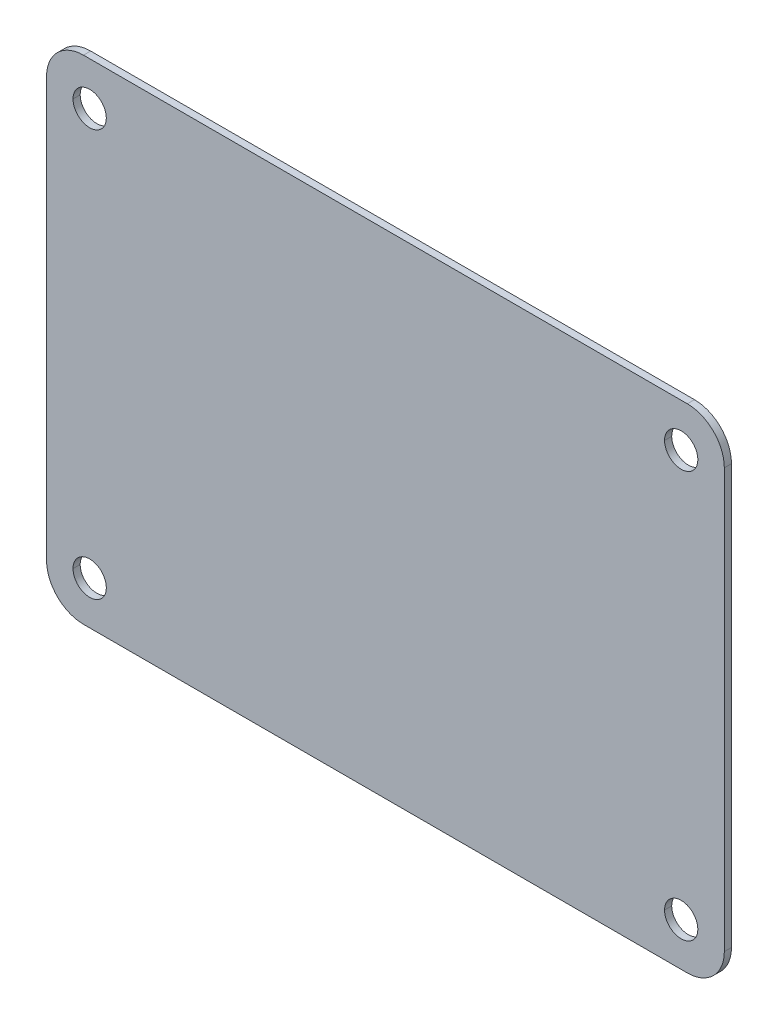
ISO-10303-21;
HEADER;
FILE_DESCRIPTION(('STEP AP214'),'2;1');
FILE_NAME('part.step','',(''),(''),'','','');
FILE_SCHEMA(('AUTOMOTIVE_DESIGN { 1 0 10303 214 1 1 1 1 }'));
ENDSEC;
DATA;
#1=APPLICATION_CONTEXT('core data for automotive mechanical design processes');
#2=APPLICATION_PROTOCOL_DEFINITION('international standard','automotive_design',2000,#1);
#3=PRODUCT_CONTEXT('',#1,'mechanical');
#4=PRODUCT('Part','Part','',(#3));
#5=PRODUCT_RELATED_PRODUCT_CATEGORY('part','',(#4));
#6=PRODUCT_DEFINITION_FORMATION('','',#4);
#7=PRODUCT_DEFINITION_CONTEXT('part definition',#1,'design');
#8=PRODUCT_DEFINITION('design','',#6,#7);
#9=PRODUCT_DEFINITION_SHAPE('','',#8);
#10=(LENGTH_UNIT() NAMED_UNIT(*) SI_UNIT(.MILLI.,.METRE.));
#11=(NAMED_UNIT(*) PLANE_ANGLE_UNIT() SI_UNIT($,.RADIAN.));
#12=(NAMED_UNIT(*) SI_UNIT($,.STERADIAN.) SOLID_ANGLE_UNIT());
#13=UNCERTAINTY_MEASURE_WITH_UNIT(LENGTH_MEASURE(1.E-05),#10,'distance_accuracy_value','');
#14=(GEOMETRIC_REPRESENTATION_CONTEXT(3) GLOBAL_UNCERTAINTY_ASSIGNED_CONTEXT((#13)) GLOBAL_UNIT_ASSIGNED_CONTEXT((#10,
#11,#12)) REPRESENTATION_CONTEXT('',''));
#15=CARTESIAN_POINT('',(0.,0.,0.));
#16=DIRECTION('',(0.,0.,1.));
#17=DIRECTION('',(1.,0.,0.));
#18=AXIS2_PLACEMENT_3D('',#15,#16,#17);
#19=CARTESIAN_POINT('',(27.499999555869,35.999999598533,0.8761000001));
#20=DIRECTION('',(0.,0.,1.));
#21=DIRECTION('',(1.,0.,0.));
#22=AXIS2_PLACEMENT_3D('',#19,#20,#21);
#23=PLANE('',#22);
#24=CARTESIAN_POINT('',(51.500000136726,52.499998525994,0.8761000001));
#25=DIRECTION('',(0.,0.,-1.));
#26=DIRECTION('',(1.,0.,0.));
#27=AXIS2_PLACEMENT_3D('',#24,#25,#26);
#28=CIRCLE('',#27,1.349999863275);
#29=CARTESIAN_POINT('',(52.850000000001,52.499998525994,0.8761000001));
#30=VERTEX_POINT('',#29);
#31=CARTESIAN_POINT('',(50.150000273451,52.499998525994,0.8761000001));
#32=VERTEX_POINT('',#31);
#33=EDGE_CURVE('E169',#30,#32,#28,.T.);
#34=ORIENTED_EDGE('',*,*,#33,.T.);
#35=CARTESIAN_POINT('',(51.500000136726,52.499998525994,0.8761000001));
#36=DIRECTION('',(0.,0.,-1.));
#37=DIRECTION('',(1.,0.,0.));
#38=AXIS2_PLACEMENT_3D('',#35,#36,#37);
#39=CIRCLE('',#38,1.349999863275);
#40=EDGE_CURVE('E11',#32,#30,#39,.T.);
#41=ORIENTED_EDGE('',*,*,#40,.T.);
#42=EDGE_LOOP('',(#34,#41));
#43=FACE_BOUND('',#42,.T.);
#44=CARTESIAN_POINT('',(3.500000092163,52.499999091341,0.8761000001));
#45=DIRECTION('',(0.,0.,-1.));
#46=DIRECTION('',(1.,0.,0.));
#47=AXIS2_PLACEMENT_3D('',#44,#45,#46);
#48=CIRCLE('',#47,1.349999907837);
#49=CARTESIAN_POINT('',(4.85,52.499999091341,0.8761000001));
#50=VERTEX_POINT('',#49);
#51=CARTESIAN_POINT('',(2.150000184326,52.499999091341,0.8761000001));
#52=VERTEX_POINT('',#51);
#53=EDGE_CURVE('E235',#50,#52,#48,.T.);
#54=ORIENTED_EDGE('',*,*,#53,.T.);
#55=CARTESIAN_POINT('',(3.500000092163,52.499999091341,0.8761000001));
#56=DIRECTION('',(0.,0.,-1.));
#57=DIRECTION('',(1.,0.,0.));
#58=AXIS2_PLACEMENT_3D('',#55,#56,#57);
#59=CIRCLE('',#58,1.349999907837);
#60=EDGE_CURVE('E28',#52,#50,#59,.T.);
#61=ORIENTED_EDGE('',*,*,#60,.T.);
#62=EDGE_LOOP('',(#54,#61));
#63=FACE_BOUND('',#62,.T.);
#64=CARTESIAN_POINT('',(51.500000136726,19.499998525994,0.8761000001));
#65=DIRECTION('',(0.,0.,-1.));
#66=DIRECTION('',(1.,0.,0.));
#67=AXIS2_PLACEMENT_3D('',#64,#65,#66);
#68=CIRCLE('',#67,1.349999863275);
#69=CARTESIAN_POINT('',(52.850000000001,19.499998525994,0.8761000001));
#70=VERTEX_POINT('',#69);
#71=CARTESIAN_POINT('',(50.150000273451,19.499998525994,0.8761000001));
#72=VERTEX_POINT('',#71);
#73=EDGE_CURVE('E247',#70,#72,#68,.T.);
#74=ORIENTED_EDGE('',*,*,#73,.T.);
#75=CARTESIAN_POINT('',(51.500000136726,19.499998525994,0.8761000001));
#76=DIRECTION('',(0.,0.,-1.));
#77=DIRECTION('',(1.,0.,0.));
#78=AXIS2_PLACEMENT_3D('',#75,#76,#77);
#79=CIRCLE('',#78,1.349999863275);
#80=EDGE_CURVE('E246',#72,#70,#79,.T.);
#81=ORIENTED_EDGE('',*,*,#80,.T.);
#82=EDGE_LOOP('',(#74,#81));
#83=FACE_BOUND('',#82,.T.);
#84=CARTESIAN_POINT('',(3.499999780028,19.496399991386,0.8761000001));
#85=DIRECTION('',(0.,0.,-1.));
#86=DIRECTION('',(1.,0.,0.));
#87=AXIS2_PLACEMENT_3D('',#84,#85,#86);
#88=CIRCLE('',#87,1.350000219972);
#89=CARTESIAN_POINT('',(4.85,19.496399991386,0.8761000001));
#90=VERTEX_POINT('',#89);
#91=CARTESIAN_POINT('',(2.149999560056,19.496399991386,0.8761000001));
#92=VERTEX_POINT('',#91);
#93=EDGE_CURVE('E188',#90,#92,#88,.T.);
#94=ORIENTED_EDGE('',*,*,#93,.T.);
#95=CARTESIAN_POINT('',(3.499999780028,19.496399991386,0.8761000001));
#96=DIRECTION('',(0.,0.,-1.));
#97=DIRECTION('',(1.,0.,0.));
#98=AXIS2_PLACEMENT_3D('',#95,#96,#97);
#99=CIRCLE('',#98,1.350000219972);
#100=EDGE_CURVE('E206',#92,#90,#99,.T.);
#101=ORIENTED_EDGE('',*,*,#100,.T.);
#102=EDGE_LOOP('',(#94,#101));
#103=FACE_BOUND('',#102,.T.);
#104=DIRECTION('',(0.,1.,0.));
#105=VECTOR('',#104,1.);
#106=CARTESIAN_POINT('',(55.,53.,0.8761000001));
#107=LINE('',#106,#105);
#108=CARTESIAN_POINT('',(55.,19.000001303345,0.8761000001));
#109=VERTEX_POINT('',#108);
#110=CARTESIAN_POINT('',(55.000000000004,52.999993225551,0.8761000001));
#111=VERTEX_POINT('',#110);
#112=EDGE_CURVE('E310',#109,#111,#107,.T.);
#113=ORIENTED_EDGE('',*,*,#112,.T.);
#114=CARTESIAN_POINT('',(51.999993225551,52.999993225551,0.8761000001));
#115=DIRECTION('',(0.,0.,-1.));
#116=DIRECTION('',(1.,0.,0.));
#117=AXIS2_PLACEMENT_3D('',#114,#115,#116);
#118=CIRCLE('',#117,3.000006774456);
#119=CARTESIAN_POINT('',(51.999996612776,56.,0.8761000001));
#120=VERTEX_POINT('',#119);
#121=EDGE_CURVE('E198',#120,#111,#118,.T.);
#122=ORIENTED_EDGE('',*,*,#121,.F.);
#123=DIRECTION('',(-1.,0.,0.));
#124=VECTOR('',#123,1.);
#125=CARTESIAN_POINT('',(3.,56.,0.8761000001));
#126=LINE('',#125,#124);
#127=CARTESIAN_POINT('',(3.000001694072,56.,0.8761000001));
#128=VERTEX_POINT('',#127);
#129=EDGE_CURVE('E201',#120,#128,#126,.T.);
#130=ORIENTED_EDGE('',*,*,#129,.T.);
#131=CARTESIAN_POINT('',(3.000003388144,52.999996611856,0.8761000001));
#132=DIRECTION('',(0.,0.,-1.));
#133=DIRECTION('',(1.,0.,0.));
#134=AXIS2_PLACEMENT_3D('',#131,#132,#133);
#135=CIRCLE('',#134,3.000003388146);
#136=CARTESIAN_POINT('',(0.,52.999998305928,0.8761000001));
#137=VERTEX_POINT('',#136);
#138=EDGE_CURVE('E42',#137,#128,#135,.T.);
#139=ORIENTED_EDGE('',*,*,#138,.F.);
#140=DIRECTION('',(0.,-1.,0.));
#141=VECTOR('',#140,1.);
#142=CARTESIAN_POINT('',(0.,19.,0.8761000001));
#143=LINE('',#142,#141);
#144=CARTESIAN_POINT('',(0.,18.9999996102,0.8761000001));
#145=VERTEX_POINT('',#144);
#146=EDGE_CURVE('E207',#137,#145,#143,.T.);
#147=ORIENTED_EDGE('',*,*,#146,.T.);
#148=CARTESIAN_POINT('',(2.999999220399,18.9999992204,0.8761000001));
#149=DIRECTION('',(0.,0.,-1.));
#150=DIRECTION('',(1.,0.,0.));
#151=AXIS2_PLACEMENT_3D('',#148,#149,#150);
#152=CIRCLE('',#151,2.9999992204);
#153=CARTESIAN_POINT('',(2.9999996102,16.,0.8761000001));
#154=VERTEX_POINT('',#153);
#155=EDGE_CURVE('E268',#154,#145,#152,.T.);
#156=ORIENTED_EDGE('',*,*,#155,.F.);
#157=DIRECTION('',(1.,0.,0.));
#158=VECTOR('',#157,1.);
#159=CARTESIAN_POINT('',(52.,16.,0.8761000001));
#160=LINE('',#159,#158);
#161=CARTESIAN_POINT('',(51.999998696655,16.,0.8761000001));
#162=VERTEX_POINT('',#161);
#163=EDGE_CURVE('E289',#154,#162,#160,.T.);
#164=ORIENTED_EDGE('',*,*,#163,.T.);
#165=CARTESIAN_POINT('',(51.999997393309,19.00000260669,0.8761000001));
#166=DIRECTION('',(0.,0.,-1.));
#167=DIRECTION('',(1.,0.,0.));
#168=AXIS2_PLACEMENT_3D('',#165,#166,#167);
#169=CIRCLE('',#168,3.000002606692);
#170=EDGE_CURVE('E21',#109,#162,#169,.T.);
#171=ORIENTED_EDGE('',*,*,#170,.F.);
#172=EDGE_LOOP('',(#113,#122,#130,#139,#147,#156,#164,#171));
#173=FACE_BOUND('',#172,.T.);
#174=ADVANCED_FACE('F17',(#43,#63,#83,#103,#173),#23,.T.);
#175=CARTESIAN_POINT('',(51.500000136726,52.499998525994,0.2961000001));
#176=DIRECTION('',(0.,0.,1.));
#177=DIRECTION('',(1.,0.,0.));
#178=AXIS2_PLACEMENT_3D('',#175,#176,#177);
#179=CYLINDRICAL_SURFACE('',#178,1.349999863275);
#180=DIRECTION('',(0.,0.,1.));
#181=VECTOR('',#180,1.);
#182=CARTESIAN_POINT('',(50.150000273451,52.499998525994,0.2961000001));
#183=LINE('',#182,#181);
#184=CARTESIAN_POINT('',(50.150000273451,52.499998525994,0.2961000001));
#185=VERTEX_POINT('',#184);
#186=EDGE_CURVE('E163',#185,#32,#183,.T.);
#187=ORIENTED_EDGE('',*,*,#186,.F.);
#188=CARTESIAN_POINT('',(51.500000136726,52.499998525994,0.2961000001));
#189=DIRECTION('',(0.,0.,-1.));
#190=DIRECTION('',(1.,0.,0.));
#191=AXIS2_PLACEMENT_3D('',#188,#189,#190);
#192=CIRCLE('',#191,1.349999863275);
#193=CARTESIAN_POINT('',(52.850000000001,52.499998525994,0.2961000001));
#194=VERTEX_POINT('',#193);
#195=EDGE_CURVE('E282',#185,#194,#192,.T.);
#196=ORIENTED_EDGE('',*,*,#195,.T.);
#197=DIRECTION('',(0.,0.,1.));
#198=VECTOR('',#197,1.);
#199=CARTESIAN_POINT('',(52.850000000001,52.499998525994,0.2961000001));
#200=LINE('',#199,#198);
#201=EDGE_CURVE('E166',#194,#30,#200,.T.);
#202=ORIENTED_EDGE('',*,*,#201,.T.);
#203=ORIENTED_EDGE('',*,*,#40,.F.);
#204=EDGE_LOOP('',(#187,#196,#202,#203));
#205=FACE_BOUND('',#204,.T.);
#206=ADVANCED_FACE('F161',(#205),#179,.F.);
#207=CARTESIAN_POINT('',(3.500000092163,52.499999091341,0.2961000001));
#208=DIRECTION('',(0.,0.,1.));
#209=DIRECTION('',(1.,0.,0.));
#210=AXIS2_PLACEMENT_3D('',#207,#208,#209);
#211=CYLINDRICAL_SURFACE('',#210,1.349999907837);
#212=DIRECTION('',(0.,0.,1.));
#213=VECTOR('',#212,1.);
#214=CARTESIAN_POINT('',(2.150000184326,52.499999091341,0.2961000001));
#215=LINE('',#214,#213);
#216=CARTESIAN_POINT('',(2.150000184326,52.499999091341,0.2961000001));
#217=VERTEX_POINT('',#216);
#218=EDGE_CURVE('E255',#217,#52,#215,.T.);
#219=ORIENTED_EDGE('',*,*,#218,.F.);
#220=CARTESIAN_POINT('',(3.500000092163,52.499999091341,0.2961000001));
#221=DIRECTION('',(0.,0.,-1.));
#222=DIRECTION('',(1.,0.,0.));
#223=AXIS2_PLACEMENT_3D('',#220,#221,#222);
#224=CIRCLE('',#223,1.349999907837);
#225=CARTESIAN_POINT('',(4.85,52.499999091341,0.2961000001));
#226=VERTEX_POINT('',#225);
#227=EDGE_CURVE('E286',#217,#226,#224,.T.);
#228=ORIENTED_EDGE('',*,*,#227,.T.);
#229=DIRECTION('',(0.,0.,1.));
#230=VECTOR('',#229,1.);
#231=CARTESIAN_POINT('',(4.85,52.499999091341,0.2961000001));
#232=LINE('',#231,#230);
#233=EDGE_CURVE('E182',#226,#50,#232,.T.);
#234=ORIENTED_EDGE('',*,*,#233,.T.);
#235=ORIENTED_EDGE('',*,*,#60,.F.);
#236=EDGE_LOOP('',(#219,#228,#234,#235));
#237=FACE_BOUND('',#236,.T.);
#238=ADVANCED_FACE('F635',(#237),#211,.F.);
#239=CARTESIAN_POINT('',(51.500000136726,19.499998525994,0.2961000001));
#240=DIRECTION('',(0.,0.,1.));
#241=DIRECTION('',(1.,0.,0.));
#242=AXIS2_PLACEMENT_3D('',#239,#240,#241);
#243=CYLINDRICAL_SURFACE('',#242,1.349999863275);
#244=DIRECTION('',(0.,0.,1.));
#245=VECTOR('',#244,1.);
#246=CARTESIAN_POINT('',(50.150000273451,19.499998525994,0.2961000001));
#247=LINE('',#246,#245);
#248=CARTESIAN_POINT('',(50.150000273451,19.499998525994,0.2961000001));
#249=VERTEX_POINT('',#248);
#250=EDGE_CURVE('E219',#249,#72,#247,.T.);
#251=ORIENTED_EDGE('',*,*,#250,.F.);
#252=CARTESIAN_POINT('',(51.500000136726,19.499998525994,0.2961000001));
#253=DIRECTION('',(0.,0.,-1.));
#254=DIRECTION('',(1.,0.,0.));
#255=AXIS2_PLACEMENT_3D('',#252,#253,#254);
#256=CIRCLE('',#255,1.349999863275);
#257=CARTESIAN_POINT('',(52.850000000001,19.499998525994,0.2961000001));
#258=VERTEX_POINT('',#257);
#259=EDGE_CURVE('E275',#249,#258,#256,.T.);
#260=ORIENTED_EDGE('',*,*,#259,.T.);
#261=DIRECTION('',(0.,0.,1.));
#262=VECTOR('',#261,1.);
#263=CARTESIAN_POINT('',(52.850000000001,19.499998525994,0.2961000001));
#264=LINE('',#263,#262);
#265=EDGE_CURVE('E251',#258,#70,#264,.T.);
#266=ORIENTED_EDGE('',*,*,#265,.T.);
#267=ORIENTED_EDGE('',*,*,#80,.F.);
#268=EDGE_LOOP('',(#251,#260,#266,#267));
#269=FACE_BOUND('',#268,.T.);
#270=ADVANCED_FACE('F326',(#269),#243,.F.);
#271=CARTESIAN_POINT('',(3.499999780028,19.496399991386,0.2961000001));
#272=DIRECTION('',(0.,0.,1.));
#273=DIRECTION('',(1.,0.,0.));
#274=AXIS2_PLACEMENT_3D('',#271,#272,#273);
#275=CYLINDRICAL_SURFACE('',#274,1.350000219972);
#276=DIRECTION('',(0.,0.,1.));
#277=VECTOR('',#276,1.);
#278=CARTESIAN_POINT('',(2.149999560056,19.496399991386,0.2961000001));
#279=LINE('',#278,#277);
#280=CARTESIAN_POINT('',(2.149999560056,19.496399991386,0.2961000001));
#281=VERTEX_POINT('',#280);
#282=EDGE_CURVE('E193',#281,#92,#279,.T.);
#283=ORIENTED_EDGE('',*,*,#282,.F.);
#284=CARTESIAN_POINT('',(3.499999780028,19.496399991386,0.2961000001));
#285=DIRECTION('',(0.,0.,-1.));
#286=DIRECTION('',(1.,0.,0.));
#287=AXIS2_PLACEMENT_3D('',#284,#285,#286);
#288=CIRCLE('',#287,1.350000219972);
#289=CARTESIAN_POINT('',(4.85,19.496399991386,0.2961000001));
#290=VERTEX_POINT('',#289);
#291=EDGE_CURVE('E272',#281,#290,#288,.T.);
#292=ORIENTED_EDGE('',*,*,#291,.T.);
#293=DIRECTION('',(0.,0.,1.));
#294=VECTOR('',#293,1.);
#295=CARTESIAN_POINT('',(4.85,19.496399991386,0.2961000001));
#296=LINE('',#295,#294);
#297=EDGE_CURVE('E192',#290,#90,#296,.T.);
#298=ORIENTED_EDGE('',*,*,#297,.T.);
#299=ORIENTED_EDGE('',*,*,#100,.F.);
#300=EDGE_LOOP('',(#283,#292,#298,#299));
#301=FACE_BOUND('',#300,.T.);
#302=ADVANCED_FACE('F19',(#301),#275,.F.);
#303=CARTESIAN_POINT('',(3.000003388144,52.999996611856,0.2961000001));
#304=DIRECTION('',(0.,0.,1.));
#305=DIRECTION('',(1.,0.,0.));
#306=AXIS2_PLACEMENT_3D('',#303,#304,#305);
#307=CYLINDRICAL_SURFACE('',#306,3.000003388146);
#308=CARTESIAN_POINT('',(3.000003388144,52.999996611856,0.2961000001));
#309=DIRECTION('',(0.,0.,1.));
#310=DIRECTION('',(1.,0.,0.));
#311=AXIS2_PLACEMENT_3D('',#308,#309,#310);
#312=CIRCLE('',#311,3.000003388146);
#313=CARTESIAN_POINT('',(3.000001694072,56.,0.2961000001));
#314=VERTEX_POINT('',#313);
#315=CARTESIAN_POINT('',(0.,52.999998305928,0.2961000001));
#316=VERTEX_POINT('',#315);
#317=EDGE_CURVE('E260',#314,#316,#312,.T.);
#318=ORIENTED_EDGE('',*,*,#317,.T.);
#319=DIRECTION('',(0.,0.,1.));
#320=VECTOR('',#319,1.);
#321=CARTESIAN_POINT('',(0.,53.,0.2961000001));
#322=LINE('',#321,#320);
#323=EDGE_CURVE('E243',#316,#137,#322,.T.);
#324=ORIENTED_EDGE('',*,*,#323,.T.);
#325=ORIENTED_EDGE('',*,*,#138,.T.);
#326=DIRECTION('',(0.,0.,-1.));
#327=VECTOR('',#326,1.);
#328=CARTESIAN_POINT('',(3.,56.,0.2961000001));
#329=LINE('',#328,#327);
#330=EDGE_CURVE('E281',#128,#314,#329,.T.);
#331=ORIENTED_EDGE('',*,*,#330,.T.);
#332=EDGE_LOOP('',(#318,#324,#325,#331));
#333=FACE_BOUND('',#332,.T.);
#334=ADVANCED_FACE('F610',(#333),#307,.T.);
#335=CARTESIAN_POINT('',(0.,19.,0.2961000001));
#336=DIRECTION('',(1.,0.,0.));
#337=DIRECTION('',(0.,1.,0.));
#338=AXIS2_PLACEMENT_3D('',#335,#336,#337);
#339=PLANE('',#338);
#340=ORIENTED_EDGE('',*,*,#323,.F.);
#341=DIRECTION('',(0.,-1.,0.));
#342=VECTOR('',#341,1.);
#343=CARTESIAN_POINT('',(0.,35.999999598533,0.2961000001));
#344=LINE('',#343,#342);
#345=CARTESIAN_POINT('',(0.,18.9999996102,0.2961000001));
#346=VERTEX_POINT('',#345);
#347=EDGE_CURVE('E228',#316,#346,#344,.T.);
#348=ORIENTED_EDGE('',*,*,#347,.T.);
#349=DIRECTION('',(0.,0.,-1.));
#350=VECTOR('',#349,1.);
#351=CARTESIAN_POINT('',(0.,19.,0.2961000001));
#352=LINE('',#351,#350);
#353=EDGE_CURVE('E265',#145,#346,#352,.T.);
#354=ORIENTED_EDGE('',*,*,#353,.F.);
#355=ORIENTED_EDGE('',*,*,#146,.F.);
#356=EDGE_LOOP('',(#340,#348,#354,#355));
#357=FACE_BOUND('',#356,.T.);
#358=ADVANCED_FACE('F602',(#357),#339,.F.);
#359=CARTESIAN_POINT('',(2.999999220399,18.9999992204,0.2961000001));
#360=DIRECTION('',(0.,0.,1.));
#361=DIRECTION('',(1.,0.,0.));
#362=AXIS2_PLACEMENT_3D('',#359,#360,#361);
#363=CYLINDRICAL_SURFACE('',#362,2.9999992204);
#364=CARTESIAN_POINT('',(2.999999220399,18.9999992204,0.2961000001));
#365=DIRECTION('',(0.,0.,1.));
#366=DIRECTION('',(1.,0.,0.));
#367=AXIS2_PLACEMENT_3D('',#364,#365,#366);
#368=CIRCLE('',#367,2.9999992204);
#369=CARTESIAN_POINT('',(2.9999996102,16.,0.2961000001));
#370=VERTEX_POINT('',#369);
#371=EDGE_CURVE('E224',#346,#370,#368,.T.);
#372=ORIENTED_EDGE('',*,*,#371,.T.);
#373=DIRECTION('',(0.,0.,1.));
#374=VECTOR('',#373,1.);
#375=CARTESIAN_POINT('',(3.,16.,0.2961000001));
#376=LINE('',#375,#374);
#377=EDGE_CURVE('E232',#370,#154,#376,.T.);
#378=ORIENTED_EDGE('',*,*,#377,.T.);
#379=ORIENTED_EDGE('',*,*,#155,.T.);
#380=ORIENTED_EDGE('',*,*,#353,.T.);
#381=EDGE_LOOP('',(#372,#378,#379,#380));
#382=FACE_BOUND('',#381,.T.);
#383=ADVANCED_FACE('F348',(#382),#363,.T.);
#384=CARTESIAN_POINT('',(52.,16.,0.2961000001));
#385=DIRECTION('',(0.,1.,0.));
#386=DIRECTION('',(1.,0.,0.));
#387=AXIS2_PLACEMENT_3D('',#384,#385,#386);
#388=PLANE('',#387);
#389=ORIENTED_EDGE('',*,*,#377,.F.);
#390=DIRECTION('',(1.,0.,0.));
#391=VECTOR('',#390,1.);
#392=CARTESIAN_POINT('',(27.499999555869,16.,0.2961000001));
#393=LINE('',#392,#391);
#394=CARTESIAN_POINT('',(51.999998696655,16.,0.2961000001));
#395=VERTEX_POINT('',#394);
#396=EDGE_CURVE('E212',#370,#395,#393,.T.);
#397=ORIENTED_EDGE('',*,*,#396,.T.);
#398=DIRECTION('',(0.,0.,-1.));
#399=VECTOR('',#398,1.);
#400=CARTESIAN_POINT('',(52.,16.,0.2961000001));
#401=LINE('',#400,#399);
#402=EDGE_CURVE('E229',#162,#395,#401,.T.);
#403=ORIENTED_EDGE('',*,*,#402,.F.);
#404=ORIENTED_EDGE('',*,*,#163,.F.);
#405=EDGE_LOOP('',(#389,#397,#403,#404));
#406=FACE_BOUND('',#405,.T.);
#407=ADVANCED_FACE('F356',(#406),#388,.F.);
#408=CARTESIAN_POINT('',(51.999997393309,19.00000260669,0.2961000001));
#409=DIRECTION('',(0.,0.,1.));
#410=DIRECTION('',(1.,0.,0.));
#411=AXIS2_PLACEMENT_3D('',#408,#409,#410);
#412=CYLINDRICAL_SURFACE('',#411,3.000002606692);
#413=CARTESIAN_POINT('',(51.999997393309,19.00000260669,0.2961000001));
#414=DIRECTION('',(0.,0.,1.));
#415=DIRECTION('',(1.,0.,0.));
#416=AXIS2_PLACEMENT_3D('',#413,#414,#415);
#417=CIRCLE('',#416,3.000002606692);
#418=CARTESIAN_POINT('',(55.,19.000001303345,0.2961000001));
#419=VERTEX_POINT('',#418);
#420=EDGE_CURVE('E208',#395,#419,#417,.T.);
#421=ORIENTED_EDGE('',*,*,#420,.T.);
#422=DIRECTION('',(0.,0.,1.));
#423=VECTOR('',#422,1.);
#424=CARTESIAN_POINT('',(55.,19.,0.2961000001));
#425=LINE('',#424,#423);
#426=EDGE_CURVE('E186',#419,#109,#425,.T.);
#427=ORIENTED_EDGE('',*,*,#426,.T.);
#428=ORIENTED_EDGE('',*,*,#170,.T.);
#429=ORIENTED_EDGE('',*,*,#402,.T.);
#430=EDGE_LOOP('',(#421,#427,#428,#429));
#431=FACE_BOUND('',#430,.T.);
#432=ADVANCED_FACE('F362',(#431),#412,.T.);
#433=CARTESIAN_POINT('',(55.,53.,0.2961000001));
#434=DIRECTION('',(-1.,0.,0.));
#435=DIRECTION('',(0.,0.,1.));
#436=AXIS2_PLACEMENT_3D('',#433,#434,#435);
#437=PLANE('',#436);
#438=ORIENTED_EDGE('',*,*,#426,.F.);
#439=DIRECTION('',(0.,1.,0.));
#440=VECTOR('',#439,1.);
#441=CARTESIAN_POINT('',(55.,35.999999598533,0.2961000001));
#442=LINE('',#441,#440);
#443=CARTESIAN_POINT('',(55.000000000004,52.999993225551,0.2961000001));
#444=VERTEX_POINT('',#443);
#445=EDGE_CURVE('E197',#419,#444,#442,.T.);
#446=ORIENTED_EDGE('',*,*,#445,.T.);
#447=DIRECTION('',(0.,0.,-1.));
#448=VECTOR('',#447,1.);
#449=CARTESIAN_POINT('',(55.000000000008,52.999993225551,0.2961000001));
#450=LINE('',#449,#448);
#451=EDGE_CURVE('E89',#111,#444,#450,.T.);
#452=ORIENTED_EDGE('',*,*,#451,.F.);
#453=ORIENTED_EDGE('',*,*,#112,.F.);
#454=EDGE_LOOP('',(#438,#446,#452,#453));
#455=FACE_BOUND('',#454,.T.);
#456=ADVANCED_FACE('F568',(#455),#437,.F.);
#457=CARTESIAN_POINT('',(51.999993225551,52.999993225551,0.2961000001));
#458=DIRECTION('',(0.,0.,1.));
#459=DIRECTION('',(1.,0.,0.));
#460=AXIS2_PLACEMENT_3D('',#457,#458,#459);
#461=CYLINDRICAL_SURFACE('',#460,3.000006774456);
#462=CARTESIAN_POINT('',(51.999993225551,52.999993225551,0.2961000001));
#463=DIRECTION('',(0.,0.,1.));
#464=DIRECTION('',(1.,0.,0.));
#465=AXIS2_PLACEMENT_3D('',#462,#463,#464);
#466=CIRCLE('',#465,3.000006774456);
#467=CARTESIAN_POINT('',(51.999996612776,56.,0.2961000001));
#468=VERTEX_POINT('',#467);
#469=EDGE_CURVE('E194',#444,#468,#466,.T.);
#470=ORIENTED_EDGE('',*,*,#469,.T.);
#471=DIRECTION('',(0.,0.,1.));
#472=VECTOR('',#471,1.);
#473=CARTESIAN_POINT('',(52.,56.,0.2961000001));
#474=LINE('',#473,#472);
#475=EDGE_CURVE('E72',#468,#120,#474,.T.);
#476=ORIENTED_EDGE('',*,*,#475,.T.);
#477=ORIENTED_EDGE('',*,*,#121,.T.);
#478=ORIENTED_EDGE('',*,*,#451,.T.);
#479=EDGE_LOOP('',(#470,#476,#477,#478));
#480=FACE_BOUND('',#479,.T.);
#481=ADVANCED_FACE('F558',(#480),#461,.T.);
#482=CARTESIAN_POINT('',(3.,56.,0.2961000001));
#483=DIRECTION('',(0.,-1.,0.));
#484=DIRECTION('',(0.,0.,-1.));
#485=AXIS2_PLACEMENT_3D('',#482,#483,#484);
#486=PLANE('',#485);
#487=ORIENTED_EDGE('',*,*,#475,.F.);
#488=DIRECTION('',(-1.,0.,0.));
#489=VECTOR('',#488,1.);
#490=CARTESIAN_POINT('',(27.499999555869,56.,0.2961000001));
#491=LINE('',#490,#489);
#492=EDGE_CURVE('E264',#468,#314,#491,.T.);
#493=ORIENTED_EDGE('',*,*,#492,.T.);
#494=ORIENTED_EDGE('',*,*,#330,.F.);
#495=ORIENTED_EDGE('',*,*,#129,.F.);
#496=EDGE_LOOP('',(#487,#493,#494,#495));
#497=FACE_BOUND('',#496,.T.);
#498=ADVANCED_FACE('F547',(#497),#486,.F.);
#499=CARTESIAN_POINT('',(27.499999555869,35.999999598533,0.2961000001));
#500=DIRECTION('',(0.,0.,1.));
#501=DIRECTION('',(1.,0.,0.));
#502=AXIS2_PLACEMENT_3D('',#499,#500,#501);
#503=PLANE('',#502);
#504=CARTESIAN_POINT('',(51.500000136726,52.499998525994,0.2961000001));
#505=DIRECTION('',(0.,0.,-1.));
#506=DIRECTION('',(1.,0.,0.));
#507=AXIS2_PLACEMENT_3D('',#504,#505,#506);
#508=CIRCLE('',#507,1.349999863275);
#509=EDGE_CURVE('E175',#194,#185,#508,.T.);
#510=ORIENTED_EDGE('',*,*,#509,.F.);
#511=ORIENTED_EDGE('',*,*,#195,.F.);
#512=EDGE_LOOP('',(#510,#511));
#513=FACE_BOUND('',#512,.T.);
#514=CARTESIAN_POINT('',(3.500000092163,52.499999091341,0.2961000001));
#515=DIRECTION('',(0.,0.,-1.));
#516=DIRECTION('',(1.,0.,0.));
#517=AXIS2_PLACEMENT_3D('',#514,#515,#516);
#518=CIRCLE('',#517,1.349999907837);
#519=EDGE_CURVE('E252',#226,#217,#518,.T.);
#520=ORIENTED_EDGE('',*,*,#519,.F.);
#521=ORIENTED_EDGE('',*,*,#227,.F.);
#522=EDGE_LOOP('',(#520,#521));
#523=FACE_BOUND('',#522,.T.);
#524=CARTESIAN_POINT('',(51.500000136726,19.499998525994,0.2961000001));
#525=DIRECTION('',(0.,0.,-1.));
#526=DIRECTION('',(1.,0.,0.));
#527=AXIS2_PLACEMENT_3D('',#524,#525,#526);
#528=CIRCLE('',#527,1.349999863275);
#529=EDGE_CURVE('E215',#258,#249,#528,.T.);
#530=ORIENTED_EDGE('',*,*,#529,.F.);
#531=ORIENTED_EDGE('',*,*,#259,.F.);
#532=EDGE_LOOP('',(#530,#531));
#533=FACE_BOUND('',#532,.T.);
#534=CARTESIAN_POINT('',(3.499999780028,19.496399991386,0.2961000001));
#535=DIRECTION('',(0.,0.,-1.));
#536=DIRECTION('',(1.,0.,0.));
#537=AXIS2_PLACEMENT_3D('',#534,#535,#536);
#538=CIRCLE('',#537,1.350000219972);
#539=EDGE_CURVE('E220',#290,#281,#538,.T.);
#540=ORIENTED_EDGE('',*,*,#539,.F.);
#541=ORIENTED_EDGE('',*,*,#291,.F.);
#542=EDGE_LOOP('',(#540,#541));
#543=FACE_BOUND('',#542,.T.);
#544=ORIENTED_EDGE('',*,*,#469,.F.);
#545=ORIENTED_EDGE('',*,*,#445,.F.);
#546=ORIENTED_EDGE('',*,*,#420,.F.);
#547=ORIENTED_EDGE('',*,*,#396,.F.);
#548=ORIENTED_EDGE('',*,*,#371,.F.);
#549=ORIENTED_EDGE('',*,*,#347,.F.);
#550=ORIENTED_EDGE('',*,*,#317,.F.);
#551=ORIENTED_EDGE('',*,*,#492,.F.);
#552=EDGE_LOOP('',(#544,#545,#546,#547,#548,#549,#550,#551));
#553=FACE_BOUND('',#552,.T.);
#554=ADVANCED_FACE('F538',(#513,#523,#533,#543,#553),#503,.F.);
#555=CARTESIAN_POINT('',(51.500000136726,52.499998525994,0.2961000001));
#556=DIRECTION('',(0.,0.,1.));
#557=DIRECTION('',(1.,0.,0.));
#558=AXIS2_PLACEMENT_3D('',#555,#556,#557);
#559=CYLINDRICAL_SURFACE('',#558,1.349999863275);
#560=ORIENTED_EDGE('',*,*,#509,.T.);
#561=ORIENTED_EDGE('',*,*,#186,.T.);
#562=ORIENTED_EDGE('',*,*,#33,.F.);
#563=ORIENTED_EDGE('',*,*,#201,.F.);
#564=EDGE_LOOP('',(#560,#561,#562,#563));
#565=FACE_BOUND('',#564,.T.);
#566=ADVANCED_FACE('F173',(#565),#559,.F.);
#567=CARTESIAN_POINT('',(3.500000092163,52.499999091341,0.2961000001));
#568=DIRECTION('',(0.,0.,1.));
#569=DIRECTION('',(1.,0.,0.));
#570=AXIS2_PLACEMENT_3D('',#567,#568,#569);
#571=CYLINDRICAL_SURFACE('',#570,1.349999907837);
#572=ORIENTED_EDGE('',*,*,#519,.T.);
#573=ORIENTED_EDGE('',*,*,#218,.T.);
#574=ORIENTED_EDGE('',*,*,#53,.F.);
#575=ORIENTED_EDGE('',*,*,#233,.F.);
#576=EDGE_LOOP('',(#572,#573,#574,#575));
#577=FACE_BOUND('',#576,.T.);
#578=ADVANCED_FACE('F518',(#577),#571,.F.);
#579=CARTESIAN_POINT('',(51.500000136726,19.499998525994,0.2961000001));
#580=DIRECTION('',(0.,0.,1.));
#581=DIRECTION('',(1.,0.,0.));
#582=AXIS2_PLACEMENT_3D('',#579,#580,#581);
#583=CYLINDRICAL_SURFACE('',#582,1.349999863275);
#584=ORIENTED_EDGE('',*,*,#529,.T.);
#585=ORIENTED_EDGE('',*,*,#250,.T.);
#586=ORIENTED_EDGE('',*,*,#73,.F.);
#587=ORIENTED_EDGE('',*,*,#265,.F.);
#588=EDGE_LOOP('',(#584,#585,#586,#587));
#589=FACE_BOUND('',#588,.T.);
#590=ADVANCED_FACE('F330',(#589),#583,.F.);
#591=CARTESIAN_POINT('',(3.499999780028,19.496399991386,0.2961000001));
#592=DIRECTION('',(0.,0.,1.));
#593=DIRECTION('',(1.,0.,0.));
#594=AXIS2_PLACEMENT_3D('',#591,#592,#593);
#595=CYLINDRICAL_SURFACE('',#594,1.350000219972);
#596=ORIENTED_EDGE('',*,*,#539,.T.);
#597=ORIENTED_EDGE('',*,*,#282,.T.);
#598=ORIENTED_EDGE('',*,*,#93,.F.);
#599=ORIENTED_EDGE('',*,*,#297,.F.);
#600=EDGE_LOOP('',(#596,#597,#598,#599));
#601=FACE_BOUND('',#600,.T.);
#602=ADVANCED_FACE('F501',(#601),#595,.F.);
#603=CLOSED_SHELL('',(#174,#206,#238,#270,#302,#334,#358,#383,#407,#432,#456,#481,#498,#554,
#566,#578,#590,#602));
#604=MANIFOLD_SOLID_BREP('B1',#603);
#605=ADVANCED_BREP_SHAPE_REPRESENTATION('',(#18,#604),#14);
#606=SHAPE_DEFINITION_REPRESENTATION(#9,#605);
ENDSEC;
END-ISO-10303-21;
